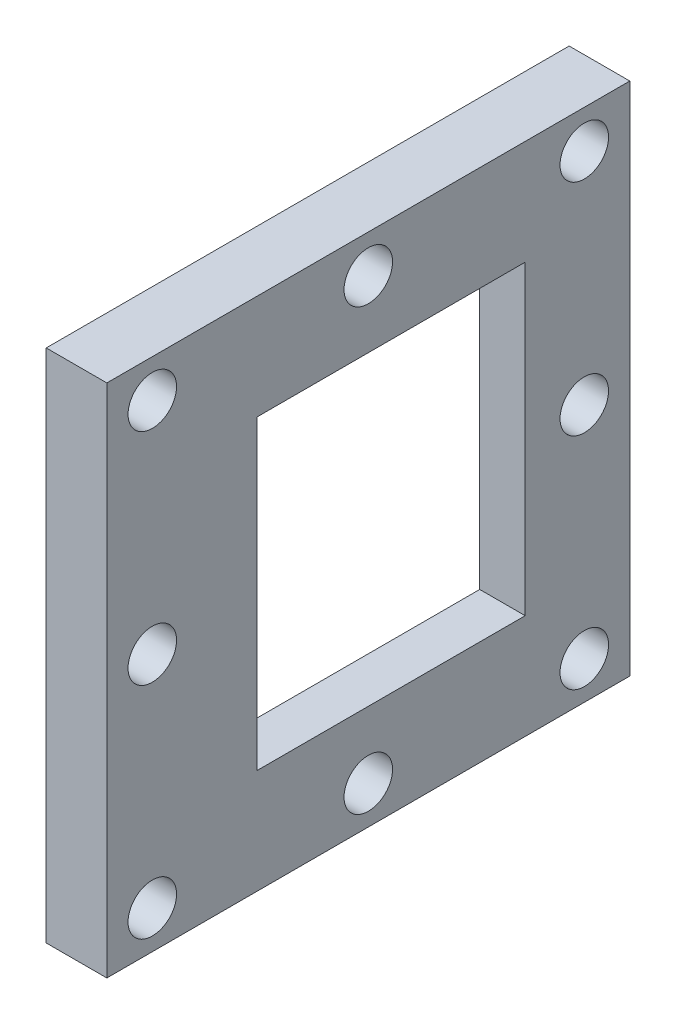
ISO-10303-21;
HEADER;
FILE_DESCRIPTION(('STEP AP214'),'2;1');
FILE_NAME('part.step','',(''),(''),'','','');
FILE_SCHEMA(('AUTOMOTIVE_DESIGN { 1 0 10303 214 1 1 1 1 }'));
ENDSEC;
DATA;
#1=APPLICATION_CONTEXT('core data for automotive mechanical design processes');
#2=APPLICATION_PROTOCOL_DEFINITION('international standard','automotive_design',2000,#1);
#3=PRODUCT_CONTEXT('',#1,'mechanical');
#4=PRODUCT('Part','Part','',(#3));
#5=PRODUCT_RELATED_PRODUCT_CATEGORY('part','',(#4));
#6=PRODUCT_DEFINITION_FORMATION('','',#4);
#7=PRODUCT_DEFINITION_CONTEXT('part definition',#1,'design');
#8=PRODUCT_DEFINITION('design','',#6,#7);
#9=PRODUCT_DEFINITION_SHAPE('','',#8);
#10=(LENGTH_UNIT() NAMED_UNIT(*) SI_UNIT(.MILLI.,.METRE.));
#11=(NAMED_UNIT(*) PLANE_ANGLE_UNIT() SI_UNIT($,.RADIAN.));
#12=(NAMED_UNIT(*) SI_UNIT($,.STERADIAN.) SOLID_ANGLE_UNIT());
#13=UNCERTAINTY_MEASURE_WITH_UNIT(LENGTH_MEASURE(1.E-05),#10,'distance_accuracy_value','');
#14=(GEOMETRIC_REPRESENTATION_CONTEXT(3) GLOBAL_UNCERTAINTY_ASSIGNED_CONTEXT((#13)) GLOBAL_UNIT_ASSIGNED_CONTEXT((#10,
#11,#12)) REPRESENTATION_CONTEXT('',''));
#15=CARTESIAN_POINT('',(0.,0.,0.));
#16=DIRECTION('',(0.,0.,1.));
#17=DIRECTION('',(1.,0.,0.));
#18=AXIS2_PLACEMENT_3D('',#15,#16,#17);
#19=CARTESIAN_POINT('',(1.,6.9,-6.9));
#20=DIRECTION('',(0.707106781186548,-0.707106781186548,0.));
#21=DIRECTION('',(0.707106781186548,0.707106781186548,0.));
#22=AXIS2_PLACEMENT_3D('',#19,#20,#21);
#23=PLANE('',#22);
#24=DIRECTION('',(0.577350269189626,0.577350269189626,-0.577350269189626));
#25=VECTOR('',#24,1.);
#26=CARTESIAN_POINT('',(0.,5.90000000000001,25.6));
#27=LINE('',#26,#25);
#28=CARTESIAN_POINT('',(0.,5.9,25.6));
#29=VERTEX_POINT('',#28);
#30=CARTESIAN_POINT('',(1.,6.9,24.6));
#31=VERTEX_POINT('',#30);
#32=EDGE_CURVE('E124',#29,#31,#27,.T.);
#33=ORIENTED_EDGE('',*,*,#32,.T.);
#34=DIRECTION('',(0.,0.,-1.));
#35=VECTOR('',#34,1.);
#36=CARTESIAN_POINT('',(1.,6.9,24.6));
#37=LINE('',#36,#35);
#38=CARTESIAN_POINT('',(1.,6.9,6.90000000000001));
#39=VERTEX_POINT('',#38);
#40=EDGE_CURVE('E102',#31,#39,#37,.T.);
#41=ORIENTED_EDGE('',*,*,#40,.T.);
#42=DIRECTION('',(-0.577350269189626,-0.577350269189626,-0.577350269189626));
#43=VECTOR('',#42,1.);
#44=CARTESIAN_POINT('',(1.,6.89999999999999,6.9));
#45=LINE('',#44,#43);
#46=CARTESIAN_POINT('',(0.,5.89999999999999,5.9));
#47=VERTEX_POINT('',#46);
#48=EDGE_CURVE('E97',#39,#47,#45,.T.);
#49=ORIENTED_EDGE('',*,*,#48,.T.);
#50=DIRECTION('',(0.,0.,-1.));
#51=VECTOR('',#50,1.);
#52=CARTESIAN_POINT('',(0.,5.9,0.));
#53=LINE('',#52,#51);
#54=EDGE_CURVE('E99',#47,#29,#53,.F.);
#55=ORIENTED_EDGE('',*,*,#54,.T.);
#56=EDGE_LOOP('',(#33,#41,#49,#55));
#57=FACE_BOUND('',#56,.T.);
#58=ADVANCED_FACE('F17',(#57),#23,.F.);
#59=CARTESIAN_POINT('',(1.,-6.8,24.6));
#60=DIRECTION('',(0.707106781186548,0.,0.707106781186548));
#61=DIRECTION('',(0.707106781186548,0.,-0.707106781186548));
#62=AXIS2_PLACEMENT_3D('',#59,#60,#61);
#63=PLANE('',#62);
#64=DIRECTION('',(0.577350269189626,-0.577350269189626,-0.577350269189626));
#65=VECTOR('',#64,1.);
#66=CARTESIAN_POINT('',(0.,28.1,25.6));
#67=LINE('',#66,#65);
#68=CARTESIAN_POINT('',(0.,28.1,25.6));
#69=VERTEX_POINT('',#68);
#70=CARTESIAN_POINT('',(1.,27.1,24.6));
#71=VERTEX_POINT('',#70);
#72=EDGE_CURVE('E122',#69,#71,#67,.T.);
#73=ORIENTED_EDGE('',*,*,#72,.T.);
#74=DIRECTION('',(0.,1.,0.));
#75=VECTOR('',#74,1.);
#76=CARTESIAN_POINT('',(1.,27.1,24.6));
#77=LINE('',#76,#75);
#78=EDGE_CURVE('E212',#71,#31,#77,.F.);
#79=ORIENTED_EDGE('',*,*,#78,.T.);
#80=ORIENTED_EDGE('',*,*,#32,.F.);
#81=DIRECTION('',(0.,1.,0.));
#82=VECTOR('',#81,1.);
#83=CARTESIAN_POINT('',(0.,0.,25.6));
#84=LINE('',#83,#82);
#85=EDGE_CURVE('E115',#29,#69,#84,.T.);
#86=ORIENTED_EDGE('',*,*,#85,.T.);
#87=EDGE_LOOP('',(#73,#79,#80,#86));
#88=FACE_BOUND('',#87,.T.);
#89=ADVANCED_FACE('F211',(#88),#63,.F.);
#90=CARTESIAN_POINT('',(1.,27.1,41.4));
#91=DIRECTION('',(0.707106781186548,0.707106781186548,0.));
#92=DIRECTION('',(-0.707106781186548,0.707106781186548,0.));
#93=AXIS2_PLACEMENT_3D('',#90,#91,#92);
#94=PLANE('',#93);
#95=DIRECTION('',(0.577350269189626,-0.577350269189626,0.577350269189626));
#96=VECTOR('',#95,1.);
#97=CARTESIAN_POINT('',(0.,28.1,5.9));
#98=LINE('',#97,#96);
#99=CARTESIAN_POINT('',(0.,28.1,5.9));
#100=VERTEX_POINT('',#99);
#101=CARTESIAN_POINT('',(1.,27.1,6.89999999999999));
#102=VERTEX_POINT('',#101);
#103=EDGE_CURVE('E92',#100,#102,#98,.T.);
#104=ORIENTED_EDGE('',*,*,#103,.T.);
#105=DIRECTION('',(0.,0.,1.));
#106=VECTOR('',#105,1.);
#107=CARTESIAN_POINT('',(1.,27.1,6.9));
#108=LINE('',#107,#106);
#109=EDGE_CURVE('E206',#102,#71,#108,.T.);
#110=ORIENTED_EDGE('',*,*,#109,.T.);
#111=ORIENTED_EDGE('',*,*,#72,.F.);
#112=DIRECTION('',(0.,0.,-1.));
#113=VECTOR('',#112,1.);
#114=CARTESIAN_POINT('',(0.,28.1,0.));
#115=LINE('',#114,#113);
#116=EDGE_CURVE('E117',#69,#100,#115,.T.);
#117=ORIENTED_EDGE('',*,*,#116,.T.);
#118=EDGE_LOOP('',(#104,#110,#111,#117));
#119=FACE_BOUND('',#118,.T.);
#120=ADVANCED_FACE('F204',(#119),#94,.F.);
#121=CARTESIAN_POINT('',(1.,40.8,6.9));
#122=DIRECTION('',(0.707106781186548,0.,-0.707106781186548));
#123=DIRECTION('',(-0.707106781186548,0.,-0.707106781186548));
#124=AXIS2_PLACEMENT_3D('',#121,#122,#123);
#125=PLANE('',#124);
#126=ORIENTED_EDGE('',*,*,#48,.F.);
#127=DIRECTION('',(0.,1.,0.));
#128=VECTOR('',#127,1.);
#129=CARTESIAN_POINT('',(1.,6.9,6.9));
#130=LINE('',#129,#128);
#131=EDGE_CURVE('E162',#39,#102,#130,.T.);
#132=ORIENTED_EDGE('',*,*,#131,.T.);
#133=ORIENTED_EDGE('',*,*,#103,.F.);
#134=DIRECTION('',(0.,1.,0.));
#135=VECTOR('',#134,1.);
#136=CARTESIAN_POINT('',(0.,0.,5.9));
#137=LINE('',#136,#135);
#138=EDGE_CURVE('E105',#100,#47,#137,.F.);
#139=ORIENTED_EDGE('',*,*,#138,.T.);
#140=EDGE_LOOP('',(#126,#132,#133,#139));
#141=FACE_BOUND('',#140,.T.);
#142=ADVANCED_FACE('F108',(#141),#125,.F.);
#143=CARTESIAN_POINT('',(0.,0.,0.));
#144=DIRECTION('',(1.,0.,0.));
#145=DIRECTION('',(0.,0.,-1.));
#146=AXIS2_PLACEMENT_3D('',#143,#144,#145);
#147=PLANE('',#146);
#148=CARTESIAN_POINT('',(0.,31.5,3.));
#149=DIRECTION('',(-1.,0.,0.));
#150=DIRECTION('',(0.,0.,1.));
#151=AXIS2_PLACEMENT_3D('',#148,#149,#150);
#152=CIRCLE('',#151,1.6);
#153=CARTESIAN_POINT('',(0.,31.5,4.6));
#154=VERTEX_POINT('',#153);
#155=EDGE_CURVE('E149',#154,#154,#152,.F.);
#156=ORIENTED_EDGE('',*,*,#155,.T.);
#157=EDGE_LOOP('',(#156));
#158=FACE_BOUND('',#157,.T.);
#159=CARTESIAN_POINT('',(0.,31.5,17.25));
#160=DIRECTION('',(-1.,0.,0.));
#161=DIRECTION('',(0.,0.,1.));
#162=AXIS2_PLACEMENT_3D('',#159,#160,#161);
#163=CIRCLE('',#162,1.6);
#164=CARTESIAN_POINT('',(0.,31.5,18.85));
#165=VERTEX_POINT('',#164);
#166=EDGE_CURVE('E153',#165,#165,#163,.F.);
#167=ORIENTED_EDGE('',*,*,#166,.T.);
#168=EDGE_LOOP('',(#167));
#169=FACE_BOUND('',#168,.T.);
#170=CARTESIAN_POINT('',(0.,31.5,31.5));
#171=DIRECTION('',(-1.,0.,0.));
#172=DIRECTION('',(0.,0.,1.));
#173=AXIS2_PLACEMENT_3D('',#170,#171,#172);
#174=CIRCLE('',#173,1.6);
#175=CARTESIAN_POINT('',(0.,31.5,33.1));
#176=VERTEX_POINT('',#175);
#177=EDGE_CURVE('E156',#176,#176,#174,.F.);
#178=ORIENTED_EDGE('',*,*,#177,.T.);
#179=EDGE_LOOP('',(#178));
#180=FACE_BOUND('',#179,.T.);
#181=CARTESIAN_POINT('',(0.,2.5,3.));
#182=DIRECTION('',(-1.,0.,0.));
#183=DIRECTION('',(0.,0.,1.));
#184=AXIS2_PLACEMENT_3D('',#181,#182,#183);
#185=CIRCLE('',#184,1.6);
#186=CARTESIAN_POINT('',(0.,2.5,4.6));
#187=VERTEX_POINT('',#186);
#188=EDGE_CURVE('E159',#187,#187,#185,.F.);
#189=ORIENTED_EDGE('',*,*,#188,.T.);
#190=EDGE_LOOP('',(#189));
#191=FACE_BOUND('',#190,.T.);
#192=CARTESIAN_POINT('',(0.,2.5,31.5));
#193=DIRECTION('',(-1.,0.,0.));
#194=DIRECTION('',(0.,0.,1.));
#195=AXIS2_PLACEMENT_3D('',#192,#193,#194);
#196=CIRCLE('',#195,1.6);
#197=CARTESIAN_POINT('',(0.,2.5,33.1));
#198=VERTEX_POINT('',#197);
#199=EDGE_CURVE('E163',#198,#198,#196,.F.);
#200=ORIENTED_EDGE('',*,*,#199,.T.);
#201=EDGE_LOOP('',(#200));
#202=FACE_BOUND('',#201,.T.);
#203=CARTESIAN_POINT('',(0.,2.5,17.25));
#204=DIRECTION('',(-1.,0.,0.));
#205=DIRECTION('',(0.,0.,1.));
#206=AXIS2_PLACEMENT_3D('',#203,#204,#205);
#207=CIRCLE('',#206,1.6);
#208=CARTESIAN_POINT('',(0.,2.5,18.85));
#209=VERTEX_POINT('',#208);
#210=EDGE_CURVE('E166',#209,#209,#207,.F.);
#211=ORIENTED_EDGE('',*,*,#210,.T.);
#212=EDGE_LOOP('',(#211));
#213=FACE_BOUND('',#212,.T.);
#214=CARTESIAN_POINT('',(0.,17.,31.5));
#215=DIRECTION('',(-1.,0.,0.));
#216=DIRECTION('',(0.,0.,1.));
#217=AXIS2_PLACEMENT_3D('',#214,#215,#216);
#218=CIRCLE('',#217,1.6);
#219=CARTESIAN_POINT('',(0.,17.,33.1));
#220=VERTEX_POINT('',#219);
#221=EDGE_CURVE('E168',#220,#220,#218,.F.);
#222=ORIENTED_EDGE('',*,*,#221,.T.);
#223=EDGE_LOOP('',(#222));
#224=FACE_BOUND('',#223,.T.);
#225=CARTESIAN_POINT('',(0.,17.,3.));
#226=DIRECTION('',(-1.,0.,0.));
#227=DIRECTION('',(0.,0.,1.));
#228=AXIS2_PLACEMENT_3D('',#225,#226,#227);
#229=CIRCLE('',#228,1.6);
#230=CARTESIAN_POINT('',(0.,17.,4.6));
#231=VERTEX_POINT('',#230);
#232=EDGE_CURVE('E20',#231,#231,#229,.F.);
#233=ORIENTED_EDGE('',*,*,#232,.T.);
#234=EDGE_LOOP('',(#233));
#235=FACE_BOUND('',#234,.T.);
#236=ORIENTED_EDGE('',*,*,#85,.F.);
#237=ORIENTED_EDGE('',*,*,#54,.F.);
#238=ORIENTED_EDGE('',*,*,#138,.F.);
#239=ORIENTED_EDGE('',*,*,#116,.F.);
#240=EDGE_LOOP('',(#236,#237,#238,#239));
#241=FACE_BOUND('',#240,.T.);
#242=DIRECTION('',(0.,1.,0.));
#243=VECTOR('',#242,1.);
#244=CARTESIAN_POINT('',(0.,34.,34.5));
#245=LINE('',#244,#243);
#246=CARTESIAN_POINT('',(0.,34.,34.5));
#247=VERTEX_POINT('',#246);
#248=CARTESIAN_POINT('',(0.,0.,34.5));
#249=VERTEX_POINT('',#248);
#250=EDGE_CURVE('E191',#247,#249,#245,.F.);
#251=ORIENTED_EDGE('',*,*,#250,.F.);
#252=DIRECTION('',(0.,0.,1.));
#253=VECTOR('',#252,1.);
#254=CARTESIAN_POINT('',(0.,34.,0.));
#255=LINE('',#254,#253);
#256=CARTESIAN_POINT('',(0.,34.,0.));
#257=VERTEX_POINT('',#256);
#258=EDGE_CURVE('E196',#257,#247,#255,.T.);
#259=ORIENTED_EDGE('',*,*,#258,.F.);
#260=DIRECTION('',(0.,1.,0.));
#261=VECTOR('',#260,1.);
#262=CARTESIAN_POINT('',(0.,0.,0.));
#263=LINE('',#262,#261);
#264=CARTESIAN_POINT('',(0.,0.,0.));
#265=VERTEX_POINT('',#264);
#266=EDGE_CURVE('E201',#265,#257,#263,.T.);
#267=ORIENTED_EDGE('',*,*,#266,.F.);
#268=DIRECTION('',(0.,0.,-1.));
#269=VECTOR('',#268,1.);
#270=CARTESIAN_POINT('',(0.,0.,34.5));
#271=LINE('',#270,#269);
#272=EDGE_CURVE('E177',#249,#265,#271,.T.);
#273=ORIENTED_EDGE('',*,*,#272,.F.);
#274=EDGE_LOOP('',(#251,#259,#267,#273));
#275=FACE_BOUND('',#274,.T.);
#276=ADVANCED_FACE('F113',(#158,#169,#180,#191,#202,#213,#224,#235,#241,#275),#147,.F.);
#277=CARTESIAN_POINT('',(0.,0.,0.));
#278=DIRECTION('',(0.,0.,-1.));
#279=DIRECTION('',(-1.,0.,0.));
#280=AXIS2_PLACEMENT_3D('',#277,#278,#279);
#281=PLANE('',#280);
#282=DIRECTION('',(1.,0.,0.));
#283=VECTOR('',#282,1.);
#284=CARTESIAN_POINT('',(0.,34.,0.));
#285=LINE('',#284,#283);
#286=CARTESIAN_POINT('',(4.,34.,0.));
#287=VERTEX_POINT('',#286);
#288=EDGE_CURVE('E198',#287,#257,#285,.F.);
#289=ORIENTED_EDGE('',*,*,#288,.F.);
#290=DIRECTION('',(0.,1.,0.));
#291=VECTOR('',#290,1.);
#292=CARTESIAN_POINT('',(4.,0.,0.));
#293=LINE('',#292,#291);
#294=CARTESIAN_POINT('',(4.,0.,0.));
#295=VERTEX_POINT('',#294);
#296=EDGE_CURVE('E152',#295,#287,#293,.T.);
#297=ORIENTED_EDGE('',*,*,#296,.F.);
#298=DIRECTION('',(1.,0.,0.));
#299=VECTOR('',#298,1.);
#300=CARTESIAN_POINT('',(0.,0.,0.));
#301=LINE('',#300,#299);
#302=EDGE_CURVE('E173',#265,#295,#301,.T.);
#303=ORIENTED_EDGE('',*,*,#302,.F.);
#304=ORIENTED_EDGE('',*,*,#266,.T.);
#305=EDGE_LOOP('',(#289,#297,#303,#304));
#306=FACE_BOUND('',#305,.T.);
#307=ADVANCED_FACE('F404',(#306),#281,.T.);
#308=CARTESIAN_POINT('',(0.,34.,0.));
#309=DIRECTION('',(0.,1.,0.));
#310=DIRECTION('',(0.,0.,1.));
#311=AXIS2_PLACEMENT_3D('',#308,#309,#310);
#312=PLANE('',#311);
#313=DIRECTION('',(1.,0.,0.));
#314=VECTOR('',#313,1.);
#315=CARTESIAN_POINT('',(0.,34.,34.5));
#316=LINE('',#315,#314);
#317=CARTESIAN_POINT('',(4.,34.,34.5));
#318=VERTEX_POINT('',#317);
#319=EDGE_CURVE('E193',#318,#247,#316,.F.);
#320=ORIENTED_EDGE('',*,*,#319,.F.);
#321=DIRECTION('',(0.,0.,-1.));
#322=VECTOR('',#321,1.);
#323=CARTESIAN_POINT('',(4.,34.,0.));
#324=LINE('',#323,#322);
#325=EDGE_CURVE('E229',#287,#318,#324,.F.);
#326=ORIENTED_EDGE('',*,*,#325,.F.);
#327=ORIENTED_EDGE('',*,*,#288,.T.);
#328=ORIENTED_EDGE('',*,*,#258,.T.);
#329=EDGE_LOOP('',(#320,#326,#327,#328));
#330=FACE_BOUND('',#329,.T.);
#331=ADVANCED_FACE('F395',(#330),#312,.T.);
#332=CARTESIAN_POINT('',(0.,34.,34.5));
#333=DIRECTION('',(0.,0.,1.));
#334=DIRECTION('',(1.,0.,0.));
#335=AXIS2_PLACEMENT_3D('',#332,#333,#334);
#336=PLANE('',#335);
#337=DIRECTION('',(1.,0.,0.));
#338=VECTOR('',#337,1.);
#339=CARTESIAN_POINT('',(0.,0.,34.5));
#340=LINE('',#339,#338);
#341=CARTESIAN_POINT('',(4.,0.,34.5));
#342=VERTEX_POINT('',#341);
#343=EDGE_CURVE('E184',#342,#249,#340,.F.);
#344=ORIENTED_EDGE('',*,*,#343,.F.);
#345=DIRECTION('',(0.,1.,0.));
#346=VECTOR('',#345,1.);
#347=CARTESIAN_POINT('',(4.,0.,34.5));
#348=LINE('',#347,#346);
#349=EDGE_CURVE('E232',#318,#342,#348,.F.);
#350=ORIENTED_EDGE('',*,*,#349,.F.);
#351=ORIENTED_EDGE('',*,*,#319,.T.);
#352=ORIENTED_EDGE('',*,*,#250,.T.);
#353=EDGE_LOOP('',(#344,#350,#351,#352));
#354=FACE_BOUND('',#353,.T.);
#355=ADVANCED_FACE('F387',(#354),#336,.T.);
#356=CARTESIAN_POINT('',(0.,0.,34.5));
#357=DIRECTION('',(0.,-1.,0.));
#358=DIRECTION('',(0.,0.,-1.));
#359=AXIS2_PLACEMENT_3D('',#356,#357,#358);
#360=PLANE('',#359);
#361=ORIENTED_EDGE('',*,*,#302,.T.);
#362=DIRECTION('',(0.,0.,-1.));
#363=VECTOR('',#362,1.);
#364=CARTESIAN_POINT('',(4.,0.,0.));
#365=LINE('',#364,#363);
#366=EDGE_CURVE('E148',#342,#295,#365,.T.);
#367=ORIENTED_EDGE('',*,*,#366,.F.);
#368=ORIENTED_EDGE('',*,*,#343,.T.);
#369=ORIENTED_EDGE('',*,*,#272,.T.);
#370=EDGE_LOOP('',(#361,#367,#368,#369));
#371=FACE_BOUND('',#370,.T.);
#372=ADVANCED_FACE('F378',(#371),#360,.T.);
#373=CARTESIAN_POINT('',(3.9,17.,3.));
#374=DIRECTION('',(-1.,0.,0.));
#375=DIRECTION('',(0.,0.,1.));
#376=AXIS2_PLACEMENT_3D('',#373,#374,#375);
#377=CYLINDRICAL_SURFACE('',#376,1.6);
#378=ORIENTED_EDGE('',*,*,#232,.F.);
#379=EDGE_LOOP('',(#378));
#380=FACE_BOUND('',#379,.T.);
#381=CARTESIAN_POINT('',(4.,17.,3.));
#382=DIRECTION('',(-1.,0.,0.));
#383=DIRECTION('',(0.,0.,1.));
#384=AXIS2_PLACEMENT_3D('',#381,#382,#383);
#385=CIRCLE('',#384,1.6);
#386=CARTESIAN_POINT('',(4.,17.,4.6));
#387=VERTEX_POINT('',#386);
#388=EDGE_CURVE('E145',#387,#387,#385,.T.);
#389=ORIENTED_EDGE('',*,*,#388,.F.);
#390=EDGE_LOOP('',(#389));
#391=FACE_BOUND('',#390,.T.);
#392=ADVANCED_FACE('F369',(#380,#391),#377,.F.);
#393=CARTESIAN_POINT('',(3.9,17.,31.5));
#394=DIRECTION('',(-1.,0.,0.));
#395=DIRECTION('',(0.,0.,1.));
#396=AXIS2_PLACEMENT_3D('',#393,#394,#395);
#397=CYLINDRICAL_SURFACE('',#396,1.6);
#398=ORIENTED_EDGE('',*,*,#221,.F.);
#399=EDGE_LOOP('',(#398));
#400=FACE_BOUND('',#399,.T.);
#401=CARTESIAN_POINT('',(4.,17.,31.5));
#402=DIRECTION('',(-1.,0.,0.));
#403=DIRECTION('',(0.,0.,1.));
#404=AXIS2_PLACEMENT_3D('',#401,#402,#403);
#405=CIRCLE('',#404,1.6);
#406=CARTESIAN_POINT('',(4.,17.,33.1));
#407=VERTEX_POINT('',#406);
#408=EDGE_CURVE('E142',#407,#407,#405,.T.);
#409=ORIENTED_EDGE('',*,*,#408,.F.);
#410=EDGE_LOOP('',(#409));
#411=FACE_BOUND('',#410,.T.);
#412=ADVANCED_FACE('F360',(#400,#411),#397,.F.);
#413=CARTESIAN_POINT('',(3.9,2.5,17.25));
#414=DIRECTION('',(-1.,0.,0.));
#415=DIRECTION('',(0.,0.,1.));
#416=AXIS2_PLACEMENT_3D('',#413,#414,#415);
#417=CYLINDRICAL_SURFACE('',#416,1.6);
#418=ORIENTED_EDGE('',*,*,#210,.F.);
#419=EDGE_LOOP('',(#418));
#420=FACE_BOUND('',#419,.T.);
#421=CARTESIAN_POINT('',(4.,2.5,17.25));
#422=DIRECTION('',(-1.,0.,0.));
#423=DIRECTION('',(0.,0.,1.));
#424=AXIS2_PLACEMENT_3D('',#421,#422,#423);
#425=CIRCLE('',#424,1.6);
#426=CARTESIAN_POINT('',(4.,2.5,18.85));
#427=VERTEX_POINT('',#426);
#428=EDGE_CURVE('E139',#427,#427,#425,.T.);
#429=ORIENTED_EDGE('',*,*,#428,.F.);
#430=EDGE_LOOP('',(#429));
#431=FACE_BOUND('',#430,.T.);
#432=ADVANCED_FACE('F263',(#420,#431),#417,.F.);
#433=CARTESIAN_POINT('',(3.9,2.5,31.5));
#434=DIRECTION('',(-1.,0.,0.));
#435=DIRECTION('',(0.,0.,1.));
#436=AXIS2_PLACEMENT_3D('',#433,#434,#435);
#437=CYLINDRICAL_SURFACE('',#436,1.6);
#438=ORIENTED_EDGE('',*,*,#199,.F.);
#439=EDGE_LOOP('',(#438));
#440=FACE_BOUND('',#439,.T.);
#441=CARTESIAN_POINT('',(4.,2.5,31.5));
#442=DIRECTION('',(-1.,0.,0.));
#443=DIRECTION('',(0.,0.,1.));
#444=AXIS2_PLACEMENT_3D('',#441,#442,#443);
#445=CIRCLE('',#444,1.6);
#446=CARTESIAN_POINT('',(4.,2.5,33.1));
#447=VERTEX_POINT('',#446);
#448=EDGE_CURVE('E135',#447,#447,#445,.T.);
#449=ORIENTED_EDGE('',*,*,#448,.F.);
#450=EDGE_LOOP('',(#449));
#451=FACE_BOUND('',#450,.T.);
#452=ADVANCED_FACE('F254',(#440,#451),#437,.F.);
#453=CARTESIAN_POINT('',(0.,6.9,24.6));
#454=DIRECTION('',(0.,-1.,0.));
#455=DIRECTION('',(0.,0.,-1.));
#456=AXIS2_PLACEMENT_3D('',#453,#454,#455);
#457=PLANE('',#456);
#458=DIRECTION('',(1.,0.,0.));
#459=VECTOR('',#458,1.);
#460=CARTESIAN_POINT('',(0.,6.9,24.6));
#461=LINE('',#460,#459);
#462=CARTESIAN_POINT('',(4.,6.9,24.6));
#463=VERTEX_POINT('',#462);
#464=EDGE_CURVE('E218',#31,#463,#461,.T.);
#465=ORIENTED_EDGE('',*,*,#464,.T.);
#466=DIRECTION('',(0.,0.,-1.));
#467=VECTOR('',#466,1.);
#468=CARTESIAN_POINT('',(4.,6.9,0.));
#469=LINE('',#468,#467);
#470=CARTESIAN_POINT('',(4.,6.9,6.9));
#471=VERTEX_POINT('',#470);
#472=EDGE_CURVE('E138',#471,#463,#469,.F.);
#473=ORIENTED_EDGE('',*,*,#472,.F.);
#474=DIRECTION('',(-1.,0.,0.));
#475=VECTOR('',#474,1.);
#476=CARTESIAN_POINT('',(0.,6.9,6.9));
#477=LINE('',#476,#475);
#478=EDGE_CURVE('E224',#471,#39,#477,.T.);
#479=ORIENTED_EDGE('',*,*,#478,.T.);
#480=ORIENTED_EDGE('',*,*,#40,.F.);
#481=EDGE_LOOP('',(#465,#473,#479,#480));
#482=FACE_BOUND('',#481,.T.);
#483=ADVANCED_FACE('F252',(#482),#457,.F.);
#484=CARTESIAN_POINT('',(0.,27.1,24.6));
#485=DIRECTION('',(0.,0.,1.));
#486=DIRECTION('',(1.,0.,0.));
#487=AXIS2_PLACEMENT_3D('',#484,#485,#486);
#488=PLANE('',#487);
#489=DIRECTION('',(1.,0.,0.));
#490=VECTOR('',#489,1.);
#491=CARTESIAN_POINT('',(0.,27.1,24.6));
#492=LINE('',#491,#490);
#493=CARTESIAN_POINT('',(4.,27.1,24.6));
#494=VERTEX_POINT('',#493);
#495=EDGE_CURVE('E217',#71,#494,#492,.T.);
#496=ORIENTED_EDGE('',*,*,#495,.T.);
#497=DIRECTION('',(0.,1.,0.));
#498=VECTOR('',#497,1.);
#499=CARTESIAN_POINT('',(4.,0.,24.6));
#500=LINE('',#499,#498);
#501=EDGE_CURVE('E238',#463,#494,#500,.T.);
#502=ORIENTED_EDGE('',*,*,#501,.F.);
#503=ORIENTED_EDGE('',*,*,#464,.F.);
#504=ORIENTED_EDGE('',*,*,#78,.F.);
#505=EDGE_LOOP('',(#496,#502,#503,#504));
#506=FACE_BOUND('',#505,.T.);
#507=ADVANCED_FACE('F215',(#506),#488,.F.);
#508=CARTESIAN_POINT('',(0.,27.1,6.9));
#509=DIRECTION('',(0.,1.,0.));
#510=DIRECTION('',(0.,0.,1.));
#511=AXIS2_PLACEMENT_3D('',#508,#509,#510);
#512=PLANE('',#511);
#513=DIRECTION('',(-1.,0.,0.));
#514=VECTOR('',#513,1.);
#515=CARTESIAN_POINT('',(0.,27.1,6.9));
#516=LINE('',#515,#514);
#517=CARTESIAN_POINT('',(4.,27.1,6.9));
#518=VERTEX_POINT('',#517);
#519=EDGE_CURVE('E35',#102,#518,#516,.F.);
#520=ORIENTED_EDGE('',*,*,#519,.T.);
#521=DIRECTION('',(0.,0.,-1.));
#522=VECTOR('',#521,1.);
#523=CARTESIAN_POINT('',(4.,27.1,0.));
#524=LINE('',#523,#522);
#525=EDGE_CURVE('E241',#494,#518,#524,.T.);
#526=ORIENTED_EDGE('',*,*,#525,.F.);
#527=ORIENTED_EDGE('',*,*,#495,.F.);
#528=ORIENTED_EDGE('',*,*,#109,.F.);
#529=EDGE_LOOP('',(#520,#526,#527,#528));
#530=FACE_BOUND('',#529,.T.);
#531=ADVANCED_FACE('F261',(#530),#512,.F.);
#532=CARTESIAN_POINT('',(0.,6.9,6.9));
#533=DIRECTION('',(0.,0.,-1.));
#534=DIRECTION('',(-1.,0.,0.));
#535=AXIS2_PLACEMENT_3D('',#532,#533,#534);
#536=PLANE('',#535);
#537=ORIENTED_EDGE('',*,*,#478,.F.);
#538=DIRECTION('',(0.,1.,0.));
#539=VECTOR('',#538,1.);
#540=CARTESIAN_POINT('',(4.,0.,6.9));
#541=LINE('',#540,#539);
#542=EDGE_CURVE('E134',#518,#471,#541,.F.);
#543=ORIENTED_EDGE('',*,*,#542,.F.);
#544=ORIENTED_EDGE('',*,*,#519,.F.);
#545=ORIENTED_EDGE('',*,*,#131,.F.);
#546=EDGE_LOOP('',(#537,#543,#544,#545));
#547=FACE_BOUND('',#546,.T.);
#548=ADVANCED_FACE('F250',(#547),#536,.F.);
#549=CARTESIAN_POINT('',(3.9,2.5,3.));
#550=DIRECTION('',(-1.,0.,0.));
#551=DIRECTION('',(0.,0.,1.));
#552=AXIS2_PLACEMENT_3D('',#549,#550,#551);
#553=CYLINDRICAL_SURFACE('',#552,1.6);
#554=ORIENTED_EDGE('',*,*,#188,.F.);
#555=EDGE_LOOP('',(#554));
#556=FACE_BOUND('',#555,.T.);
#557=CARTESIAN_POINT('',(4.,2.5,3.));
#558=DIRECTION('',(-1.,0.,0.));
#559=DIRECTION('',(0.,0.,1.));
#560=AXIS2_PLACEMENT_3D('',#557,#558,#559);
#561=CIRCLE('',#560,1.6);
#562=CARTESIAN_POINT('',(4.,2.5,4.6));
#563=VERTEX_POINT('',#562);
#564=EDGE_CURVE('E131',#563,#563,#561,.T.);
#565=ORIENTED_EDGE('',*,*,#564,.F.);
#566=EDGE_LOOP('',(#565));
#567=FACE_BOUND('',#566,.T.);
#568=ADVANCED_FACE('F284',(#556,#567),#553,.F.);
#569=CARTESIAN_POINT('',(3.9,31.5,31.5));
#570=DIRECTION('',(-1.,0.,0.));
#571=DIRECTION('',(0.,0.,1.));
#572=AXIS2_PLACEMENT_3D('',#569,#570,#571);
#573=CYLINDRICAL_SURFACE('',#572,1.6);
#574=ORIENTED_EDGE('',*,*,#177,.F.);
#575=EDGE_LOOP('',(#574));
#576=FACE_BOUND('',#575,.T.);
#577=CARTESIAN_POINT('',(4.,31.5,31.5));
#578=DIRECTION('',(-1.,0.,0.));
#579=DIRECTION('',(0.,0.,1.));
#580=AXIS2_PLACEMENT_3D('',#577,#578,#579);
#581=CIRCLE('',#580,1.6);
#582=CARTESIAN_POINT('',(4.,31.5,33.1));
#583=VERTEX_POINT('',#582);
#584=EDGE_CURVE('E128',#583,#583,#581,.T.);
#585=ORIENTED_EDGE('',*,*,#584,.F.);
#586=EDGE_LOOP('',(#585));
#587=FACE_BOUND('',#586,.T.);
#588=ADVANCED_FACE('F280',(#576,#587),#573,.F.);
#589=CARTESIAN_POINT('',(3.9,31.5,17.25));
#590=DIRECTION('',(-1.,0.,0.));
#591=DIRECTION('',(0.,0.,1.));
#592=AXIS2_PLACEMENT_3D('',#589,#590,#591);
#593=CYLINDRICAL_SURFACE('',#592,1.6);
#594=ORIENTED_EDGE('',*,*,#166,.F.);
#595=EDGE_LOOP('',(#594));
#596=FACE_BOUND('',#595,.T.);
#597=CARTESIAN_POINT('',(4.,31.5,17.25));
#598=DIRECTION('',(-1.,0.,0.));
#599=DIRECTION('',(0.,0.,1.));
#600=AXIS2_PLACEMENT_3D('',#597,#598,#599);
#601=CIRCLE('',#600,1.6);
#602=CARTESIAN_POINT('',(4.,31.5,18.85));
#603=VERTEX_POINT('',#602);
#604=EDGE_CURVE('E26',#603,#603,#601,.T.);
#605=ORIENTED_EDGE('',*,*,#604,.F.);
#606=EDGE_LOOP('',(#605));
#607=FACE_BOUND('',#606,.T.);
#608=ADVANCED_FACE('F273',(#596,#607),#593,.F.);
#609=CARTESIAN_POINT('',(3.9,31.5,3.));
#610=DIRECTION('',(-1.,0.,0.));
#611=DIRECTION('',(0.,0.,1.));
#612=AXIS2_PLACEMENT_3D('',#609,#610,#611);
#613=CYLINDRICAL_SURFACE('',#612,1.6);
#614=ORIENTED_EDGE('',*,*,#155,.F.);
#615=EDGE_LOOP('',(#614));
#616=FACE_BOUND('',#615,.T.);
#617=CARTESIAN_POINT('',(4.,31.5,3.));
#618=DIRECTION('',(-1.,0.,0.));
#619=DIRECTION('',(0.,0.,1.));
#620=AXIS2_PLACEMENT_3D('',#617,#618,#619);
#621=CIRCLE('',#620,1.6);
#622=CARTESIAN_POINT('',(4.,31.5,4.6));
#623=VERTEX_POINT('',#622);
#624=EDGE_CURVE('E11',#623,#623,#621,.T.);
#625=ORIENTED_EDGE('',*,*,#624,.F.);
#626=EDGE_LOOP('',(#625));
#627=FACE_BOUND('',#626,.T.);
#628=ADVANCED_FACE('F267',(#616,#627),#613,.F.);
#629=CARTESIAN_POINT('',(4.,0.,0.));
#630=DIRECTION('',(1.,0.,0.));
#631=DIRECTION('',(0.,0.,-1.));
#632=AXIS2_PLACEMENT_3D('',#629,#630,#631);
#633=PLANE('',#632);
#634=ORIENTED_EDGE('',*,*,#624,.T.);
#635=EDGE_LOOP('',(#634));
#636=FACE_BOUND('',#635,.T.);
#637=ORIENTED_EDGE('',*,*,#604,.T.);
#638=EDGE_LOOP('',(#637));
#639=FACE_BOUND('',#638,.T.);
#640=ORIENTED_EDGE('',*,*,#584,.T.);
#641=EDGE_LOOP('',(#640));
#642=FACE_BOUND('',#641,.T.);
#643=ORIENTED_EDGE('',*,*,#564,.T.);
#644=EDGE_LOOP('',(#643));
#645=FACE_BOUND('',#644,.T.);
#646=ORIENTED_EDGE('',*,*,#525,.T.);
#647=ORIENTED_EDGE('',*,*,#542,.T.);
#648=ORIENTED_EDGE('',*,*,#472,.T.);
#649=ORIENTED_EDGE('',*,*,#501,.T.);
#650=EDGE_LOOP('',(#646,#647,#648,#649));
#651=FACE_BOUND('',#650,.T.);
#652=ORIENTED_EDGE('',*,*,#448,.T.);
#653=EDGE_LOOP('',(#652));
#654=FACE_BOUND('',#653,.T.);
#655=ORIENTED_EDGE('',*,*,#428,.T.);
#656=EDGE_LOOP('',(#655));
#657=FACE_BOUND('',#656,.T.);
#658=ORIENTED_EDGE('',*,*,#408,.T.);
#659=EDGE_LOOP('',(#658));
#660=FACE_BOUND('',#659,.T.);
#661=ORIENTED_EDGE('',*,*,#388,.T.);
#662=EDGE_LOOP('',(#661));
#663=FACE_BOUND('',#662,.T.);
#664=ORIENTED_EDGE('',*,*,#349,.T.);
#665=ORIENTED_EDGE('',*,*,#366,.T.);
#666=ORIENTED_EDGE('',*,*,#296,.T.);
#667=ORIENTED_EDGE('',*,*,#325,.T.);
#668=EDGE_LOOP('',(#664,#665,#666,#667));
#669=FACE_BOUND('',#668,.T.);
#670=ADVANCED_FACE('F246',(#636,#639,#642,#645,#651,#654,#657,#660,#663,#669),#633,.T.);
#671=CLOSED_SHELL('',(#58,#89,#120,#142,#276,#307,#331,#355,#372,#392,#412,#432,#452,#483,#507,
#531,#548,#568,#588,#608,#628,#670));
#672=MANIFOLD_SOLID_BREP('B1',#671);
#673=ADVANCED_BREP_SHAPE_REPRESENTATION('',(#18,#672),#14);
#674=SHAPE_DEFINITION_REPRESENTATION(#9,#673);
ENDSEC;
END-ISO-10303-21;
